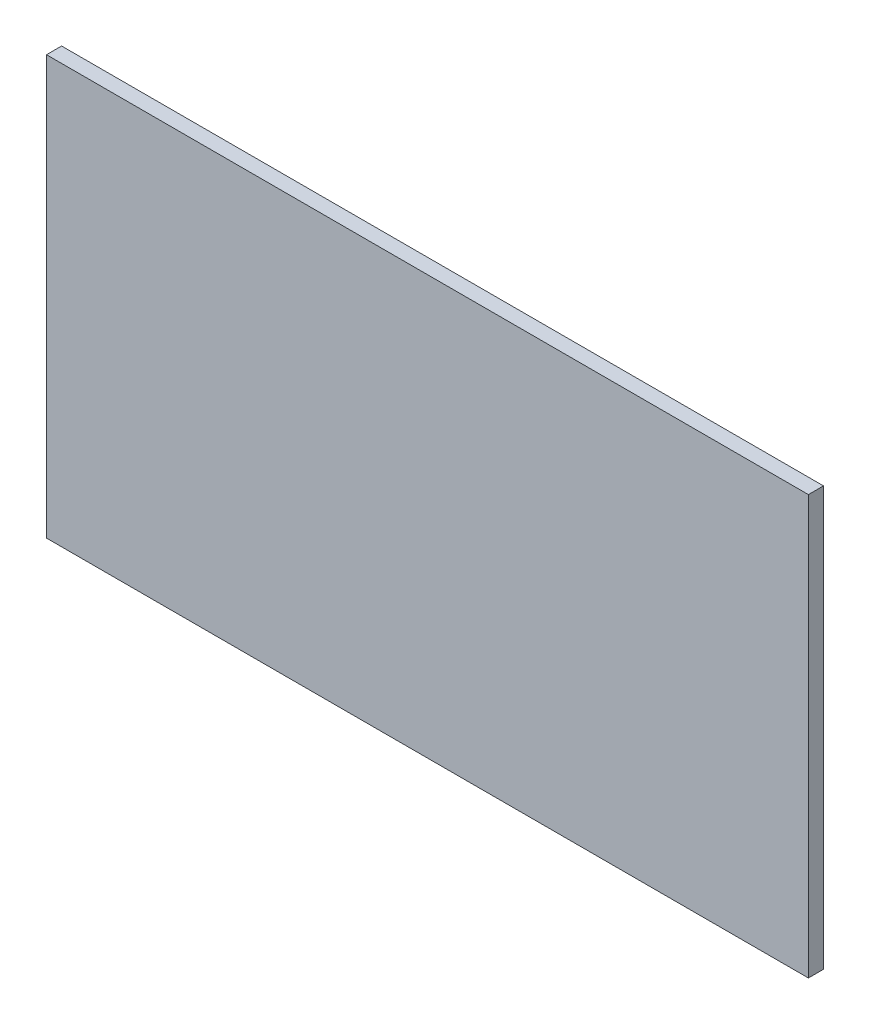
ISO-10303-21;
HEADER;
FILE_DESCRIPTION(('STEP AP214'),'2;1');
FILE_NAME('part.step','',(''),(''),'','','');
FILE_SCHEMA(('AUTOMOTIVE_DESIGN { 1 0 10303 214 1 1 1 1 }'));
ENDSEC;
DATA;
#1=APPLICATION_CONTEXT('core data for automotive mechanical design processes');
#2=APPLICATION_PROTOCOL_DEFINITION('international standard','automotive_design',2000,#1);
#3=PRODUCT_CONTEXT('',#1,'mechanical');
#4=PRODUCT('Part','Part','',(#3));
#5=PRODUCT_RELATED_PRODUCT_CATEGORY('part','',(#4));
#6=PRODUCT_DEFINITION_FORMATION('','',#4);
#7=PRODUCT_DEFINITION_CONTEXT('part definition',#1,'design');
#8=PRODUCT_DEFINITION('design','',#6,#7);
#9=PRODUCT_DEFINITION_SHAPE('','',#8);
#10=(LENGTH_UNIT() NAMED_UNIT(*) SI_UNIT(.MILLI.,.METRE.));
#11=(NAMED_UNIT(*) PLANE_ANGLE_UNIT() SI_UNIT($,.RADIAN.));
#12=(NAMED_UNIT(*) SI_UNIT($,.STERADIAN.) SOLID_ANGLE_UNIT());
#13=UNCERTAINTY_MEASURE_WITH_UNIT(LENGTH_MEASURE(1.E-05),#10,'distance_accuracy_value','');
#14=(GEOMETRIC_REPRESENTATION_CONTEXT(3) GLOBAL_UNCERTAINTY_ASSIGNED_CONTEXT((#13)) GLOBAL_UNIT_ASSIGNED_CONTEXT((#10,
#11,#12)) REPRESENTATION_CONTEXT('',''));
#15=CARTESIAN_POINT('',(0.,0.,0.));
#16=DIRECTION('',(0.,0.,1.));
#17=DIRECTION('',(1.,0.,0.));
#18=AXIS2_PLACEMENT_3D('',#15,#16,#17);
#19=CARTESIAN_POINT('',(0.,0.,0.4));
#20=DIRECTION('',(1.,0.,0.));
#21=DIRECTION('',(0.,0.,-1.));
#22=AXIS2_PLACEMENT_3D('',#19,#20,#21);
#23=PLANE('',#22);
#24=DIRECTION('',(0.,-1.,0.));
#25=VECTOR('',#24,1.);
#26=CARTESIAN_POINT('',(0.,0.,0.));
#27=LINE('',#26,#25);
#28=CARTESIAN_POINT('',(0.,11.1,0.));
#29=VERTEX_POINT('',#28);
#30=CARTESIAN_POINT('',(0.,0.,0.));
#31=VERTEX_POINT('',#30);
#32=EDGE_CURVE('E96',#29,#31,#27,.T.);
#33=ORIENTED_EDGE('',*,*,#32,.T.);
#34=DIRECTION('',(0.,0.,-1.));
#35=VECTOR('',#34,1.);
#36=CARTESIAN_POINT('',(0.,0.,0.4));
#37=LINE('',#36,#35);
#38=CARTESIAN_POINT('',(0.,0.,0.4));
#39=VERTEX_POINT('',#38);
#40=EDGE_CURVE('E11',#39,#31,#37,.T.);
#41=ORIENTED_EDGE('',*,*,#40,.F.);
#42=DIRECTION('',(0.,-1.,0.));
#43=VECTOR('',#42,1.);
#44=CARTESIAN_POINT('',(0.,0.,0.4));
#45=LINE('',#44,#43);
#46=CARTESIAN_POINT('',(0.,11.1,0.4));
#47=VERTEX_POINT('',#46);
#48=EDGE_CURVE('E84',#47,#39,#45,.T.);
#49=ORIENTED_EDGE('',*,*,#48,.F.);
#50=DIRECTION('',(0.,0.,-1.));
#51=VECTOR('',#50,1.);
#52=CARTESIAN_POINT('',(0.,11.1,0.4));
#53=LINE('',#52,#51);
#54=EDGE_CURVE('E92',#47,#29,#53,.T.);
#55=ORIENTED_EDGE('',*,*,#54,.T.);
#56=EDGE_LOOP('',(#33,#41,#49,#55));
#57=FACE_BOUND('',#56,.T.);
#58=ADVANCED_FACE('F33',(#57),#23,.F.);
#59=CARTESIAN_POINT('',(0.,0.,0.4));
#60=DIRECTION('',(0.,1.,0.));
#61=DIRECTION('',(0.,0.,1.));
#62=AXIS2_PLACEMENT_3D('',#59,#60,#61);
#63=PLANE('',#62);
#64=DIRECTION('',(1.,0.,0.));
#65=VECTOR('',#64,1.);
#66=CARTESIAN_POINT('',(0.,0.,0.));
#67=LINE('',#66,#65);
#68=CARTESIAN_POINT('',(20.2,0.,0.));
#69=VERTEX_POINT('',#68);
#70=EDGE_CURVE('E88',#31,#69,#67,.T.);
#71=ORIENTED_EDGE('',*,*,#70,.T.);
#72=DIRECTION('',(0.,0.,-1.));
#73=VECTOR('',#72,1.);
#74=CARTESIAN_POINT('',(20.2,0.,0.4));
#75=LINE('',#74,#73);
#76=CARTESIAN_POINT('',(20.2,0.,0.4));
#77=VERTEX_POINT('',#76);
#78=EDGE_CURVE('E41',#77,#69,#75,.T.);
#79=ORIENTED_EDGE('',*,*,#78,.F.);
#80=DIRECTION('',(1.,0.,0.));
#81=VECTOR('',#80,1.);
#82=CARTESIAN_POINT('',(0.,0.,0.4));
#83=LINE('',#82,#81);
#84=EDGE_CURVE('E79',#39,#77,#83,.T.);
#85=ORIENTED_EDGE('',*,*,#84,.F.);
#86=ORIENTED_EDGE('',*,*,#40,.T.);
#87=EDGE_LOOP('',(#71,#79,#85,#86));
#88=FACE_BOUND('',#87,.T.);
#89=ADVANCED_FACE('F87',(#88),#63,.F.);
#90=CARTESIAN_POINT('',(20.2,0.,0.4));
#91=DIRECTION('',(-1.,0.,0.));
#92=DIRECTION('',(0.,0.,1.));
#93=AXIS2_PLACEMENT_3D('',#90,#91,#92);
#94=PLANE('',#93);
#95=DIRECTION('',(0.,1.,0.));
#96=VECTOR('',#95,1.);
#97=CARTESIAN_POINT('',(20.2,0.,0.));
#98=LINE('',#97,#96);
#99=CARTESIAN_POINT('',(20.2,11.1,0.));
#100=VERTEX_POINT('',#99);
#101=EDGE_CURVE('E66',#69,#100,#98,.T.);
#102=ORIENTED_EDGE('',*,*,#101,.T.);
#103=DIRECTION('',(0.,0.,-1.));
#104=VECTOR('',#103,1.);
#105=CARTESIAN_POINT('',(20.2,11.1,0.4));
#106=LINE('',#105,#104);
#107=CARTESIAN_POINT('',(20.2,11.1,0.4));
#108=VERTEX_POINT('',#107);
#109=EDGE_CURVE('E89',#108,#100,#106,.T.);
#110=ORIENTED_EDGE('',*,*,#109,.F.);
#111=DIRECTION('',(0.,1.,0.));
#112=VECTOR('',#111,1.);
#113=CARTESIAN_POINT('',(20.2,0.,0.4));
#114=LINE('',#113,#112);
#115=EDGE_CURVE('E82',#77,#108,#114,.T.);
#116=ORIENTED_EDGE('',*,*,#115,.F.);
#117=ORIENTED_EDGE('',*,*,#78,.T.);
#118=EDGE_LOOP('',(#102,#110,#116,#117));
#119=FACE_BOUND('',#118,.T.);
#120=ADVANCED_FACE('F90',(#119),#94,.F.);
#121=CARTESIAN_POINT('',(0.,11.1,0.4));
#122=DIRECTION('',(0.,-1.,0.));
#123=DIRECTION('',(0.,0.,-1.));
#124=AXIS2_PLACEMENT_3D('',#121,#122,#123);
#125=PLANE('',#124);
#126=DIRECTION('',(-1.,0.,0.));
#127=VECTOR('',#126,1.);
#128=CARTESIAN_POINT('',(0.,11.1,0.));
#129=LINE('',#128,#127);
#130=EDGE_CURVE('E72',#100,#29,#129,.T.);
#131=ORIENTED_EDGE('',*,*,#130,.T.);
#132=ORIENTED_EDGE('',*,*,#54,.F.);
#133=DIRECTION('',(-1.,0.,0.));
#134=VECTOR('',#133,1.);
#135=CARTESIAN_POINT('',(0.,11.1,0.4));
#136=LINE('',#135,#134);
#137=EDGE_CURVE('E49',#108,#47,#136,.T.);
#138=ORIENTED_EDGE('',*,*,#137,.F.);
#139=ORIENTED_EDGE('',*,*,#109,.T.);
#140=EDGE_LOOP('',(#131,#132,#138,#139));
#141=FACE_BOUND('',#140,.T.);
#142=ADVANCED_FACE('F103',(#141),#125,.F.);
#143=CARTESIAN_POINT('',(0.,0.,0.4));
#144=DIRECTION('',(0.,0.,-1.));
#145=DIRECTION('',(-1.,0.,0.));
#146=AXIS2_PLACEMENT_3D('',#143,#144,#145);
#147=PLANE('',#146);
#148=ORIENTED_EDGE('',*,*,#48,.T.);
#149=ORIENTED_EDGE('',*,*,#84,.T.);
#150=ORIENTED_EDGE('',*,*,#115,.T.);
#151=ORIENTED_EDGE('',*,*,#137,.T.);
#152=EDGE_LOOP('',(#148,#149,#150,#151));
#153=FACE_BOUND('',#152,.T.);
#154=ADVANCED_FACE('F80',(#153),#147,.F.);
#155=CARTESIAN_POINT('',(0.,0.,0.));
#156=DIRECTION('',(0.,0.,-1.));
#157=DIRECTION('',(-1.,0.,0.));
#158=AXIS2_PLACEMENT_3D('',#155,#156,#157);
#159=PLANE('',#158);
#160=ORIENTED_EDGE('',*,*,#32,.F.);
#161=ORIENTED_EDGE('',*,*,#130,.F.);
#162=ORIENTED_EDGE('',*,*,#101,.F.);
#163=ORIENTED_EDGE('',*,*,#70,.F.);
#164=EDGE_LOOP('',(#160,#161,#162,#163));
#165=FACE_BOUND('',#164,.T.);
#166=ADVANCED_FACE('F106',(#165),#159,.T.);
#167=CLOSED_SHELL('',(#58,#89,#120,#142,#154,#166));
#168=MANIFOLD_SOLID_BREP('B2',#167);
#169=ADVANCED_BREP_SHAPE_REPRESENTATION('',(#18,#168),#14);
#170=SHAPE_DEFINITION_REPRESENTATION(#9,#169);
ENDSEC;
END-ISO-10303-21;
